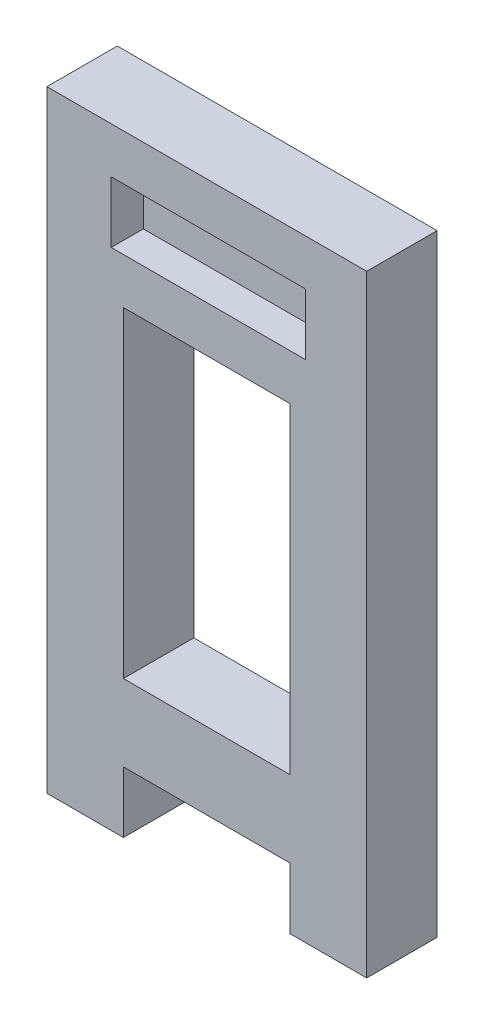
ISO-10303-21;
HEADER;
FILE_DESCRIPTION(('STEP AP214'),'2;1');
FILE_NAME('part.step','',(''),(''),'','','');
FILE_SCHEMA(('AUTOMOTIVE_DESIGN { 1 0 10303 214 1 1 1 1 }'));
ENDSEC;
DATA;
#1=APPLICATION_CONTEXT('core data for automotive mechanical design processes');
#2=APPLICATION_PROTOCOL_DEFINITION('international standard','automotive_design',2000,#1);
#3=PRODUCT_CONTEXT('',#1,'mechanical');
#4=PRODUCT('Part','Part','',(#3));
#5=PRODUCT_RELATED_PRODUCT_CATEGORY('part','',(#4));
#6=PRODUCT_DEFINITION_FORMATION('','',#4);
#7=PRODUCT_DEFINITION_CONTEXT('part definition',#1,'design');
#8=PRODUCT_DEFINITION('design','',#6,#7);
#9=PRODUCT_DEFINITION_SHAPE('','',#8);
#10=(LENGTH_UNIT() NAMED_UNIT(*) SI_UNIT(.MILLI.,.METRE.));
#11=(NAMED_UNIT(*) PLANE_ANGLE_UNIT() SI_UNIT($,.RADIAN.));
#12=(NAMED_UNIT(*) SI_UNIT($,.STERADIAN.) SOLID_ANGLE_UNIT());
#13=UNCERTAINTY_MEASURE_WITH_UNIT(LENGTH_MEASURE(1.E-05),#10,'distance_accuracy_value','');
#14=(GEOMETRIC_REPRESENTATION_CONTEXT(3) GLOBAL_UNCERTAINTY_ASSIGNED_CONTEXT((#13)) GLOBAL_UNIT_ASSIGNED_CONTEXT((#10,
#11,#12)) REPRESENTATION_CONTEXT('',''));
#15=CARTESIAN_POINT('',(0.,0.,0.));
#16=DIRECTION('',(0.,0.,1.));
#17=DIRECTION('',(1.,0.,0.));
#18=AXIS2_PLACEMENT_3D('',#15,#16,#17);
#19=CARTESIAN_POINT('',(2.1,14.5,2.3));
#20=DIRECTION('',(1.,0.,0.));
#21=DIRECTION('',(0.,0.,-1.));
#22=AXIS2_PLACEMENT_3D('',#19,#20,#21);
#23=PLANE('',#22);
#24=DIRECTION('',(0.,0.,-1.));
#25=VECTOR('',#24,1.);
#26=CARTESIAN_POINT('',(2.1,14.5,2.3));
#27=LINE('',#26,#25);
#28=CARTESIAN_POINT('',(2.1,14.5,2.3));
#29=VERTEX_POINT('',#28);
#30=CARTESIAN_POINT('',(2.1,14.5,1.25));
#31=VERTEX_POINT('',#30);
#32=EDGE_CURVE('E162',#29,#31,#27,.T.);
#33=ORIENTED_EDGE('',*,*,#32,.T.);
#34=DIRECTION('',(0.,1.,0.));
#35=VECTOR('',#34,1.);
#36=CARTESIAN_POINT('',(2.1,14.5,1.25));
#37=LINE('',#36,#35);
#38=CARTESIAN_POINT('',(2.1,16.5,1.25));
#39=VERTEX_POINT('',#38);
#40=EDGE_CURVE('E152',#31,#39,#37,.T.);
#41=ORIENTED_EDGE('',*,*,#40,.T.);
#42=DIRECTION('',(0.,0.,-1.));
#43=VECTOR('',#42,1.);
#44=CARTESIAN_POINT('',(2.1,16.5,2.3));
#45=LINE('',#44,#43);
#46=CARTESIAN_POINT('',(2.1,16.5,2.3));
#47=VERTEX_POINT('',#46);
#48=EDGE_CURVE('E159',#47,#39,#45,.T.);
#49=ORIENTED_EDGE('',*,*,#48,.F.);
#50=DIRECTION('',(0.,-1.,0.));
#51=VECTOR('',#50,1.);
#52=CARTESIAN_POINT('',(2.1,14.5,2.3));
#53=LINE('',#52,#51);
#54=EDGE_CURVE('E479',#47,#29,#53,.T.);
#55=ORIENTED_EDGE('',*,*,#54,.T.);
#56=EDGE_LOOP('',(#33,#41,#49,#55));
#57=FACE_BOUND('',#56,.T.);
#58=ADVANCED_FACE('F39',(#57),#23,.T.);
#59=CARTESIAN_POINT('',(2.1,14.5,2.3));
#60=DIRECTION('',(0.,1.,0.));
#61=DIRECTION('',(0.,0.,1.));
#62=AXIS2_PLACEMENT_3D('',#59,#60,#61);
#63=PLANE('',#62);
#64=DIRECTION('',(0.,0.,-1.));
#65=VECTOR('',#64,1.);
#66=CARTESIAN_POINT('',(8.45,14.5,2.3));
#67=LINE('',#66,#65);
#68=CARTESIAN_POINT('',(8.45,14.5,2.3));
#69=VERTEX_POINT('',#68);
#70=CARTESIAN_POINT('',(8.45,14.5,1.25));
#71=VERTEX_POINT('',#70);
#72=EDGE_CURVE('E168',#69,#71,#67,.T.);
#73=ORIENTED_EDGE('',*,*,#72,.T.);
#74=DIRECTION('',(1.,0.,0.));
#75=VECTOR('',#74,1.);
#76=CARTESIAN_POINT('',(2.1,14.5,1.25));
#77=LINE('',#76,#75);
#78=EDGE_CURVE('E480',#31,#71,#77,.T.);
#79=ORIENTED_EDGE('',*,*,#78,.F.);
#80=ORIENTED_EDGE('',*,*,#32,.F.);
#81=DIRECTION('',(1.,0.,0.));
#82=VECTOR('',#81,1.);
#83=CARTESIAN_POINT('',(2.1,14.5,2.3));
#84=LINE('',#83,#82);
#85=EDGE_CURVE('E478',#29,#69,#84,.T.);
#86=ORIENTED_EDGE('',*,*,#85,.T.);
#87=EDGE_LOOP('',(#73,#79,#80,#86));
#88=FACE_BOUND('',#87,.T.);
#89=ADVANCED_FACE('F312',(#88),#63,.T.);
#90=CARTESIAN_POINT('',(8.45,14.5,2.3));
#91=DIRECTION('',(-1.,0.,0.));
#92=DIRECTION('',(0.,0.,1.));
#93=AXIS2_PLACEMENT_3D('',#90,#91,#92);
#94=PLANE('',#93);
#95=DIRECTION('',(0.,0.,-1.));
#96=VECTOR('',#95,1.);
#97=CARTESIAN_POINT('',(8.45,16.5,2.3));
#98=LINE('',#97,#96);
#99=CARTESIAN_POINT('',(8.45,16.5,2.3));
#100=VERTEX_POINT('',#99);
#101=CARTESIAN_POINT('',(8.45,16.5,1.25));
#102=VERTEX_POINT('',#101);
#103=EDGE_CURVE('E61',#100,#102,#98,.T.);
#104=ORIENTED_EDGE('',*,*,#103,.T.);
#105=DIRECTION('',(0.,1.,0.));
#106=VECTOR('',#105,1.);
#107=CARTESIAN_POINT('',(8.45,14.5,1.25));
#108=LINE('',#107,#106);
#109=EDGE_CURVE('E54',#71,#102,#108,.T.);
#110=ORIENTED_EDGE('',*,*,#109,.F.);
#111=ORIENTED_EDGE('',*,*,#72,.F.);
#112=DIRECTION('',(0.,1.,0.));
#113=VECTOR('',#112,1.);
#114=CARTESIAN_POINT('',(8.45,14.5,2.3));
#115=LINE('',#114,#113);
#116=EDGE_CURVE('E170',#69,#100,#115,.T.);
#117=ORIENTED_EDGE('',*,*,#116,.T.);
#118=EDGE_LOOP('',(#104,#110,#111,#117));
#119=FACE_BOUND('',#118,.T.);
#120=ADVANCED_FACE('F318',(#119),#94,.T.);
#121=CARTESIAN_POINT('',(2.1,16.5,2.3));
#122=DIRECTION('',(0.,-1.,0.));
#123=DIRECTION('',(0.,0.,-1.));
#124=AXIS2_PLACEMENT_3D('',#121,#122,#123);
#125=PLANE('',#124);
#126=ORIENTED_EDGE('',*,*,#48,.T.);
#127=DIRECTION('',(1.,0.,0.));
#128=VECTOR('',#127,1.);
#129=CARTESIAN_POINT('',(2.1,16.5,1.25));
#130=LINE('',#129,#128);
#131=EDGE_CURVE('E149',#39,#102,#130,.T.);
#132=ORIENTED_EDGE('',*,*,#131,.T.);
#133=ORIENTED_EDGE('',*,*,#103,.F.);
#134=DIRECTION('',(-1.,0.,0.));
#135=VECTOR('',#134,1.);
#136=CARTESIAN_POINT('',(2.1,16.5,2.3));
#137=LINE('',#136,#135);
#138=EDGE_CURVE('E166',#100,#47,#137,.T.);
#139=ORIENTED_EDGE('',*,*,#138,.T.);
#140=EDGE_LOOP('',(#126,#132,#133,#139));
#141=FACE_BOUND('',#140,.T.);
#142=ADVANCED_FACE('F164',(#141),#125,.T.);
#143=CARTESIAN_POINT('',(0.,0.,2.3));
#144=DIRECTION('',(0.,0.,-1.));
#145=DIRECTION('',(-1.,0.,0.));
#146=AXIS2_PLACEMENT_3D('',#143,#144,#145);
#147=PLANE('',#146);
#148=DIRECTION('',(0.,1.,0.));
#149=VECTOR('',#148,1.);
#150=CARTESIAN_POINT('',(7.95,2.5,2.3));
#151=LINE('',#150,#149);
#152=CARTESIAN_POINT('',(7.95,2.5,2.3));
#153=VERTEX_POINT('',#152);
#154=CARTESIAN_POINT('',(7.95,13.,2.3));
#155=VERTEX_POINT('',#154);
#156=EDGE_CURVE('E178',#153,#155,#151,.T.);
#157=ORIENTED_EDGE('',*,*,#156,.F.);
#158=DIRECTION('',(1.,0.,0.));
#159=VECTOR('',#158,1.);
#160=CARTESIAN_POINT('',(2.5,2.5,2.3));
#161=LINE('',#160,#159);
#162=CARTESIAN_POINT('',(2.5,2.5,2.3));
#163=VERTEX_POINT('',#162);
#164=EDGE_CURVE('E186',#163,#153,#161,.T.);
#165=ORIENTED_EDGE('',*,*,#164,.F.);
#166=DIRECTION('',(0.,-1.,0.));
#167=VECTOR('',#166,1.);
#168=CARTESIAN_POINT('',(2.5,2.5,2.3));
#169=LINE('',#168,#167);
#170=CARTESIAN_POINT('',(2.5,13.,2.3));
#171=VERTEX_POINT('',#170);
#172=EDGE_CURVE('E183',#171,#163,#169,.T.);
#173=ORIENTED_EDGE('',*,*,#172,.F.);
#174=DIRECTION('',(-1.,0.,0.));
#175=VECTOR('',#174,1.);
#176=CARTESIAN_POINT('',(2.5,13.,2.3));
#177=LINE('',#176,#175);
#178=EDGE_CURVE('E180',#155,#171,#177,.T.);
#179=ORIENTED_EDGE('',*,*,#178,.F.);
#180=EDGE_LOOP('',(#157,#165,#173,#179));
#181=FACE_BOUND('',#180,.T.);
#182=DIRECTION('',(0.,-1.,0.));
#183=VECTOR('',#182,1.);
#184=CARTESIAN_POINT('',(0.,0.,2.3));
#185=LINE('',#184,#183);
#186=CARTESIAN_POINT('',(0.,18.,2.3));
#187=VERTEX_POINT('',#186);
#188=CARTESIAN_POINT('',(0.,-2.,2.3));
#189=VERTEX_POINT('',#188);
#190=EDGE_CURVE('E209',#187,#189,#185,.T.);
#191=ORIENTED_EDGE('',*,*,#190,.T.);
#192=DIRECTION('',(1.,0.,0.));
#193=VECTOR('',#192,1.);
#194=CARTESIAN_POINT('',(0.,-2.,2.3));
#195=LINE('',#194,#193);
#196=CARTESIAN_POINT('',(2.5,-2.,2.3));
#197=VERTEX_POINT('',#196);
#198=EDGE_CURVE('E211',#189,#197,#195,.T.);
#199=ORIENTED_EDGE('',*,*,#198,.T.);
#200=DIRECTION('',(0.,1.,0.));
#201=VECTOR('',#200,1.);
#202=CARTESIAN_POINT('',(2.5,-2.,2.3));
#203=LINE('',#202,#201);
#204=CARTESIAN_POINT('',(2.5,0.,2.3));
#205=VERTEX_POINT('',#204);
#206=EDGE_CURVE('E214',#197,#205,#203,.T.);
#207=ORIENTED_EDGE('',*,*,#206,.T.);
#208=DIRECTION('',(1.,0.,0.));
#209=VECTOR('',#208,1.);
#210=CARTESIAN_POINT('',(2.5,0.,2.3));
#211=LINE('',#210,#209);
#212=CARTESIAN_POINT('',(7.95,0.,2.3));
#213=VERTEX_POINT('',#212);
#214=EDGE_CURVE('E216',#205,#213,#211,.T.);
#215=ORIENTED_EDGE('',*,*,#214,.T.);
#216=DIRECTION('',(0.,-1.,0.));
#217=VECTOR('',#216,1.);
#218=CARTESIAN_POINT('',(7.95,-2.,2.3));
#219=LINE('',#218,#217);
#220=CARTESIAN_POINT('',(7.95,-2.,2.3));
#221=VERTEX_POINT('',#220);
#222=EDGE_CURVE('E218',#213,#221,#219,.T.);
#223=ORIENTED_EDGE('',*,*,#222,.T.);
#224=DIRECTION('',(1.,0.,0.));
#225=VECTOR('',#224,1.);
#226=CARTESIAN_POINT('',(10.45,-2.,2.3));
#227=LINE('',#226,#225);
#228=CARTESIAN_POINT('',(10.45,-2.,2.3));
#229=VERTEX_POINT('',#228);
#230=EDGE_CURVE('E220',#221,#229,#227,.T.);
#231=ORIENTED_EDGE('',*,*,#230,.T.);
#232=DIRECTION('',(0.,1.,0.));
#233=VECTOR('',#232,1.);
#234=CARTESIAN_POINT('',(10.45,0.,2.3));
#235=LINE('',#234,#233);
#236=CARTESIAN_POINT('',(10.45,18.,2.3));
#237=VERTEX_POINT('',#236);
#238=EDGE_CURVE('E222',#229,#237,#235,.T.);
#239=ORIENTED_EDGE('',*,*,#238,.T.);
#240=DIRECTION('',(-1.,0.,0.));
#241=VECTOR('',#240,1.);
#242=CARTESIAN_POINT('',(0.,18.,2.3));
#243=LINE('',#242,#241);
#244=EDGE_CURVE('E224',#237,#187,#243,.T.);
#245=ORIENTED_EDGE('',*,*,#244,.T.);
#246=EDGE_LOOP('',(#191,#199,#207,#215,#223,#231,#239,#245));
#247=FACE_BOUND('',#246,.T.);
#248=ORIENTED_EDGE('',*,*,#54,.F.);
#249=ORIENTED_EDGE('',*,*,#138,.F.);
#250=ORIENTED_EDGE('',*,*,#116,.F.);
#251=ORIENTED_EDGE('',*,*,#85,.F.);
#252=EDGE_LOOP('',(#248,#249,#250,#251));
#253=FACE_BOUND('',#252,.T.);
#254=ADVANCED_FACE('F285',(#181,#247,#253),#147,.F.);
#255=CARTESIAN_POINT('',(0.,0.,0.));
#256=DIRECTION('',(0.,0.,-1.));
#257=DIRECTION('',(-1.,0.,0.));
#258=AXIS2_PLACEMENT_3D('',#255,#256,#257);
#259=PLANE('',#258);
#260=DIRECTION('',(0.,-1.,0.));
#261=VECTOR('',#260,1.);
#262=CARTESIAN_POINT('',(0.,0.,0.));
#263=LINE('',#262,#261);
#264=CARTESIAN_POINT('',(0.,18.,0.));
#265=VERTEX_POINT('',#264);
#266=CARTESIAN_POINT('',(0.,-2.,0.));
#267=VERTEX_POINT('',#266);
#268=EDGE_CURVE('E208',#265,#267,#263,.T.);
#269=ORIENTED_EDGE('',*,*,#268,.F.);
#270=DIRECTION('',(-1.,0.,0.));
#271=VECTOR('',#270,1.);
#272=CARTESIAN_POINT('',(0.,18.,0.));
#273=LINE('',#272,#271);
#274=CARTESIAN_POINT('',(10.45,18.,0.));
#275=VERTEX_POINT('',#274);
#276=EDGE_CURVE('E212',#275,#265,#273,.T.);
#277=ORIENTED_EDGE('',*,*,#276,.F.);
#278=DIRECTION('',(0.,1.,0.));
#279=VECTOR('',#278,1.);
#280=CARTESIAN_POINT('',(10.45,0.,0.));
#281=LINE('',#280,#279);
#282=CARTESIAN_POINT('',(10.45,-2.,0.));
#283=VERTEX_POINT('',#282);
#284=EDGE_CURVE('E239',#283,#275,#281,.T.);
#285=ORIENTED_EDGE('',*,*,#284,.F.);
#286=DIRECTION('',(1.,0.,0.));
#287=VECTOR('',#286,1.);
#288=CARTESIAN_POINT('',(10.45,-2.,0.));
#289=LINE('',#288,#287);
#290=CARTESIAN_POINT('',(7.95,-2.,0.));
#291=VERTEX_POINT('',#290);
#292=EDGE_CURVE('E236',#291,#283,#289,.T.);
#293=ORIENTED_EDGE('',*,*,#292,.F.);
#294=DIRECTION('',(0.,-1.,0.));
#295=VECTOR('',#294,1.);
#296=CARTESIAN_POINT('',(7.95,-2.,0.));
#297=LINE('',#296,#295);
#298=CARTESIAN_POINT('',(7.95,0.,0.));
#299=VERTEX_POINT('',#298);
#300=EDGE_CURVE('E234',#299,#291,#297,.T.);
#301=ORIENTED_EDGE('',*,*,#300,.F.);
#302=DIRECTION('',(1.,0.,0.));
#303=VECTOR('',#302,1.);
#304=CARTESIAN_POINT('',(2.5,0.,0.));
#305=LINE('',#304,#303);
#306=CARTESIAN_POINT('',(2.5,0.,0.));
#307=VERTEX_POINT('',#306);
#308=EDGE_CURVE('E232',#307,#299,#305,.T.);
#309=ORIENTED_EDGE('',*,*,#308,.F.);
#310=DIRECTION('',(0.,1.,0.));
#311=VECTOR('',#310,1.);
#312=CARTESIAN_POINT('',(2.5,-2.,0.));
#313=LINE('',#312,#311);
#314=CARTESIAN_POINT('',(2.5,-2.,0.));
#315=VERTEX_POINT('',#314);
#316=EDGE_CURVE('E230',#315,#307,#313,.T.);
#317=ORIENTED_EDGE('',*,*,#316,.F.);
#318=DIRECTION('',(1.,0.,0.));
#319=VECTOR('',#318,1.);
#320=CARTESIAN_POINT('',(0.,-2.,0.));
#321=LINE('',#320,#319);
#322=EDGE_CURVE('E228',#267,#315,#321,.T.);
#323=ORIENTED_EDGE('',*,*,#322,.F.);
#324=EDGE_LOOP('',(#269,#277,#285,#293,#301,#309,#317,#323));
#325=FACE_BOUND('',#324,.T.);
#326=DIRECTION('',(1.,0.,0.));
#327=VECTOR('',#326,1.);
#328=CARTESIAN_POINT('',(2.5,2.5,0.));
#329=LINE('',#328,#327);
#330=CARTESIAN_POINT('',(2.5,2.5,0.));
#331=VERTEX_POINT('',#330);
#332=CARTESIAN_POINT('',(7.95,2.5,0.));
#333=VERTEX_POINT('',#332);
#334=EDGE_CURVE('E181',#331,#333,#329,.T.);
#335=ORIENTED_EDGE('',*,*,#334,.T.);
#336=DIRECTION('',(0.,1.,0.));
#337=VECTOR('',#336,1.);
#338=CARTESIAN_POINT('',(7.95,2.5,0.));
#339=LINE('',#338,#337);
#340=CARTESIAN_POINT('',(7.95,13.,0.));
#341=VERTEX_POINT('',#340);
#342=EDGE_CURVE('E177',#333,#341,#339,.T.);
#343=ORIENTED_EDGE('',*,*,#342,.T.);
#344=DIRECTION('',(-1.,0.,0.));
#345=VECTOR('',#344,1.);
#346=CARTESIAN_POINT('',(2.5,13.,0.));
#347=LINE('',#346,#345);
#348=CARTESIAN_POINT('',(2.5,13.,0.));
#349=VERTEX_POINT('',#348);
#350=EDGE_CURVE('E191',#341,#349,#347,.T.);
#351=ORIENTED_EDGE('',*,*,#350,.T.);
#352=DIRECTION('',(0.,-1.,0.));
#353=VECTOR('',#352,1.);
#354=CARTESIAN_POINT('',(2.5,2.5,0.));
#355=LINE('',#354,#353);
#356=EDGE_CURVE('E194',#349,#331,#355,.T.);
#357=ORIENTED_EDGE('',*,*,#356,.T.);
#358=EDGE_LOOP('',(#335,#343,#351,#357));
#359=FACE_BOUND('',#358,.T.);
#360=ADVANCED_FACE('F271',(#325,#359),#259,.T.);
#361=CARTESIAN_POINT('',(0.,0.,2.3));
#362=DIRECTION('',(1.,0.,0.));
#363=DIRECTION('',(0.,1.,0.));
#364=AXIS2_PLACEMENT_3D('',#361,#362,#363);
#365=PLANE('',#364);
#366=ORIENTED_EDGE('',*,*,#268,.T.);
#367=DIRECTION('',(0.,0.,-1.));
#368=VECTOR('',#367,1.);
#369=CARTESIAN_POINT('',(0.,-2.,2.3));
#370=LINE('',#369,#368);
#371=EDGE_CURVE('E11',#189,#267,#370,.T.);
#372=ORIENTED_EDGE('',*,*,#371,.F.);
#373=ORIENTED_EDGE('',*,*,#190,.F.);
#374=DIRECTION('',(0.,0.,-1.));
#375=VECTOR('',#374,1.);
#376=CARTESIAN_POINT('',(0.,18.,2.3));
#377=LINE('',#376,#375);
#378=EDGE_CURVE('E226',#187,#265,#377,.T.);
#379=ORIENTED_EDGE('',*,*,#378,.T.);
#380=EDGE_LOOP('',(#366,#372,#373,#379));
#381=FACE_BOUND('',#380,.T.);
#382=ADVANCED_FACE('F41',(#381),#365,.F.);
#383=CARTESIAN_POINT('',(0.,-2.,2.3));
#384=DIRECTION('',(0.,1.,0.));
#385=DIRECTION('',(0.,0.,1.));
#386=AXIS2_PLACEMENT_3D('',#383,#384,#385);
#387=PLANE('',#386);
#388=ORIENTED_EDGE('',*,*,#322,.T.);
#389=DIRECTION('',(0.,0.,-1.));
#390=VECTOR('',#389,1.);
#391=CARTESIAN_POINT('',(2.5,-2.,2.3));
#392=LINE('',#391,#390);
#393=EDGE_CURVE('E47',#197,#315,#392,.T.);
#394=ORIENTED_EDGE('',*,*,#393,.F.);
#395=ORIENTED_EDGE('',*,*,#198,.F.);
#396=ORIENTED_EDGE('',*,*,#371,.T.);
#397=EDGE_LOOP('',(#388,#394,#395,#396));
#398=FACE_BOUND('',#397,.T.);
#399=ADVANCED_FACE('F290',(#398),#387,.F.);
#400=CARTESIAN_POINT('',(2.5,-2.,2.3));
#401=DIRECTION('',(-1.,0.,0.));
#402=DIRECTION('',(0.,0.,1.));
#403=AXIS2_PLACEMENT_3D('',#400,#401,#402);
#404=PLANE('',#403);
#405=ORIENTED_EDGE('',*,*,#316,.T.);
#406=DIRECTION('',(0.,0.,-1.));
#407=VECTOR('',#406,1.);
#408=CARTESIAN_POINT('',(2.5,0.,2.3));
#409=LINE('',#408,#407);
#410=EDGE_CURVE('E257',#205,#307,#409,.T.);
#411=ORIENTED_EDGE('',*,*,#410,.F.);
#412=ORIENTED_EDGE('',*,*,#206,.F.);
#413=ORIENTED_EDGE('',*,*,#393,.T.);
#414=EDGE_LOOP('',(#405,#411,#412,#413));
#415=FACE_BOUND('',#414,.T.);
#416=ADVANCED_FACE('F264',(#415),#404,.F.);
#417=CARTESIAN_POINT('',(2.5,0.,2.3));
#418=DIRECTION('',(0.,1.,0.));
#419=DIRECTION('',(0.,0.,1.));
#420=AXIS2_PLACEMENT_3D('',#417,#418,#419);
#421=PLANE('',#420);
#422=ORIENTED_EDGE('',*,*,#308,.T.);
#423=DIRECTION('',(0.,0.,-1.));
#424=VECTOR('',#423,1.);
#425=CARTESIAN_POINT('',(7.95,0.,2.3));
#426=LINE('',#425,#424);
#427=EDGE_CURVE('E254',#213,#299,#426,.T.);
#428=ORIENTED_EDGE('',*,*,#427,.F.);
#429=ORIENTED_EDGE('',*,*,#214,.F.);
#430=ORIENTED_EDGE('',*,*,#410,.T.);
#431=EDGE_LOOP('',(#422,#428,#429,#430));
#432=FACE_BOUND('',#431,.T.);
#433=ADVANCED_FACE('F277',(#432),#421,.F.);
#434=CARTESIAN_POINT('',(7.95,-2.,2.3));
#435=DIRECTION('',(1.,0.,0.));
#436=DIRECTION('',(0.,0.,-1.));
#437=AXIS2_PLACEMENT_3D('',#434,#435,#436);
#438=PLANE('',#437);
#439=ORIENTED_EDGE('',*,*,#300,.T.);
#440=DIRECTION('',(0.,0.,-1.));
#441=VECTOR('',#440,1.);
#442=CARTESIAN_POINT('',(7.95,-2.,2.3));
#443=LINE('',#442,#441);
#444=EDGE_CURVE('E251',#221,#291,#443,.T.);
#445=ORIENTED_EDGE('',*,*,#444,.F.);
#446=ORIENTED_EDGE('',*,*,#222,.F.);
#447=ORIENTED_EDGE('',*,*,#427,.T.);
#448=EDGE_LOOP('',(#439,#445,#446,#447));
#449=FACE_BOUND('',#448,.T.);
#450=ADVANCED_FACE('F281',(#449),#438,.F.);
#451=CARTESIAN_POINT('',(10.45,-2.,2.3));
#452=DIRECTION('',(0.,1.,0.));
#453=DIRECTION('',(-1.,0.,0.));
#454=AXIS2_PLACEMENT_3D('',#451,#452,#453);
#455=PLANE('',#454);
#456=ORIENTED_EDGE('',*,*,#292,.T.);
#457=DIRECTION('',(0.,0.,-1.));
#458=VECTOR('',#457,1.);
#459=CARTESIAN_POINT('',(10.45,-2.,2.3));
#460=LINE('',#459,#458);
#461=EDGE_CURVE('E248',#229,#283,#460,.T.);
#462=ORIENTED_EDGE('',*,*,#461,.F.);
#463=ORIENTED_EDGE('',*,*,#230,.F.);
#464=ORIENTED_EDGE('',*,*,#444,.T.);
#465=EDGE_LOOP('',(#456,#462,#463,#464));
#466=FACE_BOUND('',#465,.T.);
#467=ADVANCED_FACE('F302',(#466),#455,.F.);
#468=CARTESIAN_POINT('',(10.45,0.,2.3));
#469=DIRECTION('',(-1.,0.,0.));
#470=DIRECTION('',(0.,0.,1.));
#471=AXIS2_PLACEMENT_3D('',#468,#469,#470);
#472=PLANE('',#471);
#473=ORIENTED_EDGE('',*,*,#284,.T.);
#474=DIRECTION('',(0.,0.,-1.));
#475=VECTOR('',#474,1.);
#476=CARTESIAN_POINT('',(10.45,18.,2.3));
#477=LINE('',#476,#475);
#478=EDGE_CURVE('E245',#237,#275,#477,.T.);
#479=ORIENTED_EDGE('',*,*,#478,.F.);
#480=ORIENTED_EDGE('',*,*,#238,.F.);
#481=ORIENTED_EDGE('',*,*,#461,.T.);
#482=EDGE_LOOP('',(#473,#479,#480,#481));
#483=FACE_BOUND('',#482,.T.);
#484=ADVANCED_FACE('F300',(#483),#472,.F.);
#485=CARTESIAN_POINT('',(0.,18.,2.3));
#486=DIRECTION('',(0.,-1.,0.));
#487=DIRECTION('',(0.,0.,-1.));
#488=AXIS2_PLACEMENT_3D('',#485,#486,#487);
#489=PLANE('',#488);
#490=ORIENTED_EDGE('',*,*,#276,.T.);
#491=ORIENTED_EDGE('',*,*,#378,.F.);
#492=ORIENTED_EDGE('',*,*,#244,.F.);
#493=ORIENTED_EDGE('',*,*,#478,.T.);
#494=EDGE_LOOP('',(#490,#491,#492,#493));
#495=FACE_BOUND('',#494,.T.);
#496=ADVANCED_FACE('F295',(#495),#489,.F.);
#497=CARTESIAN_POINT('',(7.95,2.5,2.3));
#498=DIRECTION('',(-1.,0.,0.));
#499=DIRECTION('',(0.,0.,1.));
#500=AXIS2_PLACEMENT_3D('',#497,#498,#499);
#501=PLANE('',#500);
#502=ORIENTED_EDGE('',*,*,#342,.F.);
#503=DIRECTION('',(0.,0.,-1.));
#504=VECTOR('',#503,1.);
#505=CARTESIAN_POINT('',(7.95,2.5,2.3));
#506=LINE('',#505,#504);
#507=EDGE_CURVE('E188',#153,#333,#506,.T.);
#508=ORIENTED_EDGE('',*,*,#507,.F.);
#509=ORIENTED_EDGE('',*,*,#156,.T.);
#510=DIRECTION('',(0.,0.,-1.));
#511=VECTOR('',#510,1.);
#512=CARTESIAN_POINT('',(7.95,13.,2.3));
#513=LINE('',#512,#511);
#514=EDGE_CURVE('E205',#155,#341,#513,.T.);
#515=ORIENTED_EDGE('',*,*,#514,.T.);
#516=EDGE_LOOP('',(#502,#508,#509,#515));
#517=FACE_BOUND('',#516,.T.);
#518=ADVANCED_FACE('F333',(#517),#501,.T.);
#519=CARTESIAN_POINT('',(2.5,13.,2.3));
#520=DIRECTION('',(0.,-1.,0.));
#521=DIRECTION('',(0.,0.,-1.));
#522=AXIS2_PLACEMENT_3D('',#519,#520,#521);
#523=PLANE('',#522);
#524=ORIENTED_EDGE('',*,*,#350,.F.);
#525=ORIENTED_EDGE('',*,*,#514,.F.);
#526=ORIENTED_EDGE('',*,*,#178,.T.);
#527=DIRECTION('',(0.,0.,-1.));
#528=VECTOR('',#527,1.);
#529=CARTESIAN_POINT('',(2.5,13.,2.3));
#530=LINE('',#529,#528);
#531=EDGE_CURVE('E203',#171,#349,#530,.T.);
#532=ORIENTED_EDGE('',*,*,#531,.T.);
#533=EDGE_LOOP('',(#524,#525,#526,#532));
#534=FACE_BOUND('',#533,.T.);
#535=ADVANCED_FACE('F329',(#534),#523,.T.);
#536=CARTESIAN_POINT('',(2.5,2.5,2.3));
#537=DIRECTION('',(1.,0.,0.));
#538=DIRECTION('',(0.,0.,-1.));
#539=AXIS2_PLACEMENT_3D('',#536,#537,#538);
#540=PLANE('',#539);
#541=ORIENTED_EDGE('',*,*,#356,.F.);
#542=ORIENTED_EDGE('',*,*,#531,.F.);
#543=ORIENTED_EDGE('',*,*,#172,.T.);
#544=DIRECTION('',(0.,0.,-1.));
#545=VECTOR('',#544,1.);
#546=CARTESIAN_POINT('',(2.5,2.5,2.3));
#547=LINE('',#546,#545);
#548=EDGE_CURVE('E201',#163,#331,#547,.T.);
#549=ORIENTED_EDGE('',*,*,#548,.T.);
#550=EDGE_LOOP('',(#541,#542,#543,#549));
#551=FACE_BOUND('',#550,.T.);
#552=ADVANCED_FACE('F325',(#551),#540,.T.);
#553=CARTESIAN_POINT('',(2.5,2.5,2.3));
#554=DIRECTION('',(0.,1.,0.));
#555=DIRECTION('',(0.,0.,1.));
#556=AXIS2_PLACEMENT_3D('',#553,#554,#555);
#557=PLANE('',#556);
#558=ORIENTED_EDGE('',*,*,#334,.F.);
#559=ORIENTED_EDGE('',*,*,#548,.F.);
#560=ORIENTED_EDGE('',*,*,#164,.T.);
#561=ORIENTED_EDGE('',*,*,#507,.T.);
#562=EDGE_LOOP('',(#558,#559,#560,#561));
#563=FACE_BOUND('',#562,.T.);
#564=ADVANCED_FACE('F323',(#563),#557,.T.);
#565=CARTESIAN_POINT('',(0.,0.,1.25));
#566=DIRECTION('',(0.,0.,-1.));
#567=DIRECTION('',(-1.,0.,0.));
#568=AXIS2_PLACEMENT_3D('',#565,#566,#567);
#569=PLANE('',#568);
#570=ORIENTED_EDGE('',*,*,#40,.F.);
#571=ORIENTED_EDGE('',*,*,#78,.T.);
#572=ORIENTED_EDGE('',*,*,#109,.T.);
#573=ORIENTED_EDGE('',*,*,#131,.F.);
#574=EDGE_LOOP('',(#570,#571,#572,#573));
#575=FACE_BOUND('',#574,.T.);
#576=ADVANCED_FACE('F151',(#575),#569,.F.);
#577=CLOSED_SHELL('',(#58,#89,#120,#142,#254,#360,#382,#399,#416,#433,#450,#467,#484,#496,#518,
#535,#552,#564,#576));
#578=MANIFOLD_SOLID_BREP('B2',#577);
#579=ADVANCED_BREP_SHAPE_REPRESENTATION('',(#18,#578),#14);
#580=SHAPE_DEFINITION_REPRESENTATION(#9,#579);
ENDSEC;
END-ISO-10303-21;
